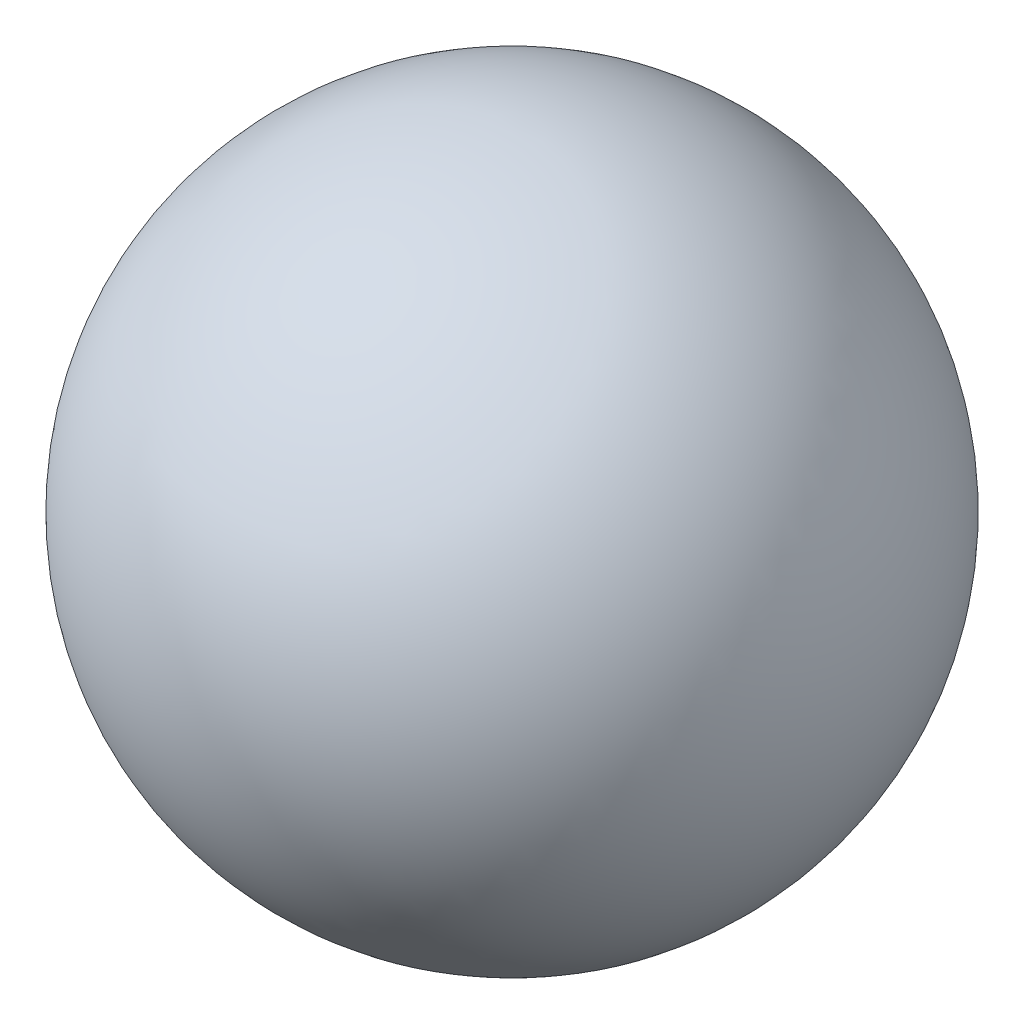
ISO-10303-21;
HEADER;
FILE_DESCRIPTION(('STEP AP214'),'2;1');
FILE_NAME('part.step','',(''),(''),'','','');
FILE_SCHEMA(('AUTOMOTIVE_DESIGN { 1 0 10303 214 1 1 1 1 }'));
ENDSEC;
DATA;
#1=APPLICATION_CONTEXT('core data for automotive mechanical design processes');
#2=APPLICATION_PROTOCOL_DEFINITION('international standard','automotive_design',2000,#1);
#3=PRODUCT_CONTEXT('',#1,'mechanical');
#4=PRODUCT('Part','Part','',(#3));
#5=PRODUCT_RELATED_PRODUCT_CATEGORY('part','',(#4));
#6=PRODUCT_DEFINITION_FORMATION('','',#4);
#7=PRODUCT_DEFINITION_CONTEXT('part definition',#1,'design');
#8=PRODUCT_DEFINITION('design','',#6,#7);
#9=PRODUCT_DEFINITION_SHAPE('','',#8);
#10=(LENGTH_UNIT() NAMED_UNIT(*) SI_UNIT(.MILLI.,.METRE.));
#11=(NAMED_UNIT(*) PLANE_ANGLE_UNIT() SI_UNIT($,.RADIAN.));
#12=(NAMED_UNIT(*) SI_UNIT($,.STERADIAN.) SOLID_ANGLE_UNIT());
#13=UNCERTAINTY_MEASURE_WITH_UNIT(LENGTH_MEASURE(1.E-05),#10,'distance_accuracy_value','');
#14=(GEOMETRIC_REPRESENTATION_CONTEXT(3) GLOBAL_UNCERTAINTY_ASSIGNED_CONTEXT((#13)) GLOBAL_UNIT_ASSIGNED_CONTEXT((#10,
#11,#12)) REPRESENTATION_CONTEXT('',''));
#15=CARTESIAN_POINT('',(0.,0.,0.));
#16=DIRECTION('',(0.,0.,1.));
#17=DIRECTION('',(1.,0.,0.));
#18=AXIS2_PLACEMENT_3D('',#15,#16,#17);
#19=CARTESIAN_POINT('',(0.,0.,0.));
#20=DIRECTION('',(0.,1.,0.));
#21=DIRECTION('',(1.,0.,0.));
#22=AXIS2_PLACEMENT_3D('',#19,#20,#21);
#23=SPHERICAL_SURFACE('',#22,3.5);
#24=CARTESIAN_POINT('',(0.,3.5,0.));
#25=VERTEX_POINT('',#24);
#26=VERTEX_LOOP('',#25);
#27=FACE_BOUND('',#26,.T.);
#28=ADVANCED_FACE('F32',(#27),#23,.T.);
#29=CLOSED_SHELL('',(#28));
#30=MANIFOLD_SOLID_BREP('B2',#29);
#31=ADVANCED_BREP_SHAPE_REPRESENTATION('',(#18,#30),#14);
#32=SHAPE_DEFINITION_REPRESENTATION(#9,#31);
ENDSEC;
END-ISO-10303-21;
